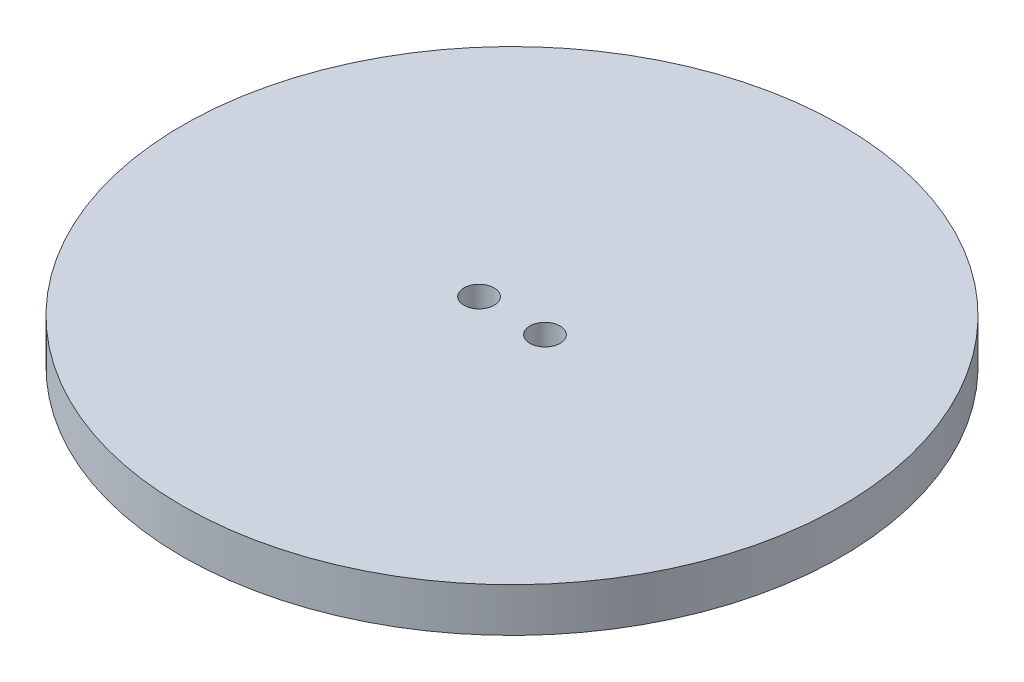
ISO-10303-21;
HEADER;
FILE_DESCRIPTION(('STEP AP214'),'2;1');
FILE_NAME('part.step','',(''),(''),'','','');
FILE_SCHEMA(('AUTOMOTIVE_DESIGN { 1 0 10303 214 1 1 1 1 }'));
ENDSEC;
DATA;
#1=APPLICATION_CONTEXT('core data for automotive mechanical design processes');
#2=APPLICATION_PROTOCOL_DEFINITION('international standard','automotive_design',2000,#1);
#3=PRODUCT_CONTEXT('',#1,'mechanical');
#4=PRODUCT('Part','Part','',(#3));
#5=PRODUCT_RELATED_PRODUCT_CATEGORY('part','',(#4));
#6=PRODUCT_DEFINITION_FORMATION('','',#4);
#7=PRODUCT_DEFINITION_CONTEXT('part definition',#1,'design');
#8=PRODUCT_DEFINITION('design','',#6,#7);
#9=PRODUCT_DEFINITION_SHAPE('','',#8);
#10=(LENGTH_UNIT() NAMED_UNIT(*) SI_UNIT(.MILLI.,.METRE.));
#11=(NAMED_UNIT(*) PLANE_ANGLE_UNIT() SI_UNIT($,.RADIAN.));
#12=(NAMED_UNIT(*) SI_UNIT($,.STERADIAN.) SOLID_ANGLE_UNIT());
#13=UNCERTAINTY_MEASURE_WITH_UNIT(LENGTH_MEASURE(1.E-05),#10,'distance_accuracy_value','');
#14=(GEOMETRIC_REPRESENTATION_CONTEXT(3) GLOBAL_UNCERTAINTY_ASSIGNED_CONTEXT((#13)) GLOBAL_UNIT_ASSIGNED_CONTEXT((#10,
#11,#12)) REPRESENTATION_CONTEXT('',''));
#15=CARTESIAN_POINT('',(0.,0.,0.));
#16=DIRECTION('',(0.,0.,1.));
#17=DIRECTION('',(1.,0.,0.));
#18=AXIS2_PLACEMENT_3D('',#15,#16,#17);
#19=CARTESIAN_POINT('',(0.,8.,0.));
#20=DIRECTION('',(0.,-1.,0.));
#21=DIRECTION('',(0.,0.,-1.));
#22=AXIS2_PLACEMENT_3D('',#19,#20,#21);
#23=CYLINDRICAL_SURFACE('',#22,60.);
#24=CARTESIAN_POINT('',(0.,8.,0.));
#25=DIRECTION('',(0.,1.,0.));
#26=DIRECTION('',(0.,0.,1.));
#27=AXIS2_PLACEMENT_3D('',#24,#25,#26);
#28=CIRCLE('',#27,60.);
#29=CARTESIAN_POINT('',(0.,8.,60.));
#30=VERTEX_POINT('',#29);
#31=EDGE_CURVE('E10',#30,#30,#28,.T.);
#32=ORIENTED_EDGE('',*,*,#31,.F.);
#33=EDGE_LOOP('',(#32));
#34=FACE_BOUND('',#33,.T.);
#35=CARTESIAN_POINT('',(0.,0.,0.));
#36=DIRECTION('',(0.,1.,0.));
#37=DIRECTION('',(0.,0.,1.));
#38=AXIS2_PLACEMENT_3D('',#35,#36,#37);
#39=CIRCLE('',#38,60.);
#40=CARTESIAN_POINT('',(0.,0.,60.));
#41=VERTEX_POINT('',#40);
#42=EDGE_CURVE('E34',#41,#41,#39,.T.);
#43=ORIENTED_EDGE('',*,*,#42,.T.);
#44=EDGE_LOOP('',(#43));
#45=FACE_BOUND('',#44,.T.);
#46=ADVANCED_FACE('F31',(#34,#45),#23,.T.);
#47=CARTESIAN_POINT('',(0.,8.,0.));
#48=DIRECTION('',(0.,1.,0.));
#49=DIRECTION('',(0.,0.,1.));
#50=AXIS2_PLACEMENT_3D('',#47,#48,#49);
#51=PLANE('',#50);
#52=CARTESIAN_POINT('',(-6.,8.,0.));
#53=DIRECTION('',(0.,1.,0.));
#54=DIRECTION('',(0.,0.,1.));
#55=AXIS2_PLACEMENT_3D('',#52,#53,#54);
#56=CIRCLE('',#55,2.75);
#57=CARTESIAN_POINT('',(-6.,8.,2.75));
#58=VERTEX_POINT('',#57);
#59=EDGE_CURVE('E49',#58,#58,#56,.T.);
#60=ORIENTED_EDGE('',*,*,#59,.F.);
#61=EDGE_LOOP('',(#60));
#62=FACE_BOUND('',#61,.T.);
#63=CARTESIAN_POINT('',(6.,8.,0.));
#64=DIRECTION('',(0.,1.,0.));
#65=DIRECTION('',(0.,0.,1.));
#66=AXIS2_PLACEMENT_3D('',#63,#64,#65);
#67=CIRCLE('',#66,2.75);
#68=CARTESIAN_POINT('',(6.,8.,2.75));
#69=VERTEX_POINT('',#68);
#70=EDGE_CURVE('E43',#69,#69,#67,.T.);
#71=ORIENTED_EDGE('',*,*,#70,.F.);
#72=EDGE_LOOP('',(#71));
#73=FACE_BOUND('',#72,.T.);
#74=ORIENTED_EDGE('',*,*,#31,.T.);
#75=EDGE_LOOP('',(#74));
#76=FACE_BOUND('',#75,.T.);
#77=ADVANCED_FACE('F65',(#62,#73,#76),#51,.T.);
#78=CARTESIAN_POINT('',(0.,0.,0.));
#79=DIRECTION('',(0.,1.,0.));
#80=DIRECTION('',(0.,0.,1.));
#81=AXIS2_PLACEMENT_3D('',#78,#79,#80);
#82=PLANE('',#81);
#83=CARTESIAN_POINT('',(-6.,0.,0.));
#84=DIRECTION('',(0.,1.,0.));
#85=DIRECTION('',(0.,0.,1.));
#86=AXIS2_PLACEMENT_3D('',#83,#84,#85);
#87=CIRCLE('',#86,2.75);
#88=CARTESIAN_POINT('',(-6.,0.,2.75));
#89=VERTEX_POINT('',#88);
#90=EDGE_CURVE('E46',#89,#89,#87,.T.);
#91=ORIENTED_EDGE('',*,*,#90,.T.);
#92=EDGE_LOOP('',(#91));
#93=FACE_BOUND('',#92,.T.);
#94=CARTESIAN_POINT('',(6.,0.,0.));
#95=DIRECTION('',(0.,1.,0.));
#96=DIRECTION('',(0.,0.,1.));
#97=AXIS2_PLACEMENT_3D('',#94,#95,#96);
#98=CIRCLE('',#97,2.75);
#99=CARTESIAN_POINT('',(6.,0.,2.75));
#100=VERTEX_POINT('',#99);
#101=EDGE_CURVE('E41',#100,#100,#98,.T.);
#102=ORIENTED_EDGE('',*,*,#101,.T.);
#103=EDGE_LOOP('',(#102));
#104=FACE_BOUND('',#103,.T.);
#105=ORIENTED_EDGE('',*,*,#42,.F.);
#106=EDGE_LOOP('',(#105));
#107=FACE_BOUND('',#106,.T.);
#108=ADVANCED_FACE('F55',(#93,#104,#107),#82,.F.);
#109=CARTESIAN_POINT('',(6.,0.,0.));
#110=DIRECTION('',(0.,1.,0.));
#111=DIRECTION('',(0.,0.,1.));
#112=AXIS2_PLACEMENT_3D('',#109,#110,#111);
#113=CYLINDRICAL_SURFACE('',#112,2.75);
#114=ORIENTED_EDGE('',*,*,#101,.F.);
#115=EDGE_LOOP('',(#114));
#116=FACE_BOUND('',#115,.T.);
#117=ORIENTED_EDGE('',*,*,#70,.T.);
#118=EDGE_LOOP('',(#117));
#119=FACE_BOUND('',#118,.T.);
#120=ADVANCED_FACE('F61',(#116,#119),#113,.F.);
#121=CARTESIAN_POINT('',(-6.,0.,0.));
#122=DIRECTION('',(0.,1.,0.));
#123=DIRECTION('',(0.,0.,1.));
#124=AXIS2_PLACEMENT_3D('',#121,#122,#123);
#125=CYLINDRICAL_SURFACE('',#124,2.75);
#126=ORIENTED_EDGE('',*,*,#90,.F.);
#127=EDGE_LOOP('',(#126));
#128=FACE_BOUND('',#127,.T.);
#129=ORIENTED_EDGE('',*,*,#59,.T.);
#130=EDGE_LOOP('',(#129));
#131=FACE_BOUND('',#130,.T.);
#132=ADVANCED_FACE('F58',(#128,#131),#125,.F.);
#133=CLOSED_SHELL('',(#46,#77,#108,#120,#132));
#134=MANIFOLD_SOLID_BREP('B2',#133);
#135=ADVANCED_BREP_SHAPE_REPRESENTATION('',(#18,#134),#14);
#136=SHAPE_DEFINITION_REPRESENTATION(#9,#135);
ENDSEC;
END-ISO-10303-21;
